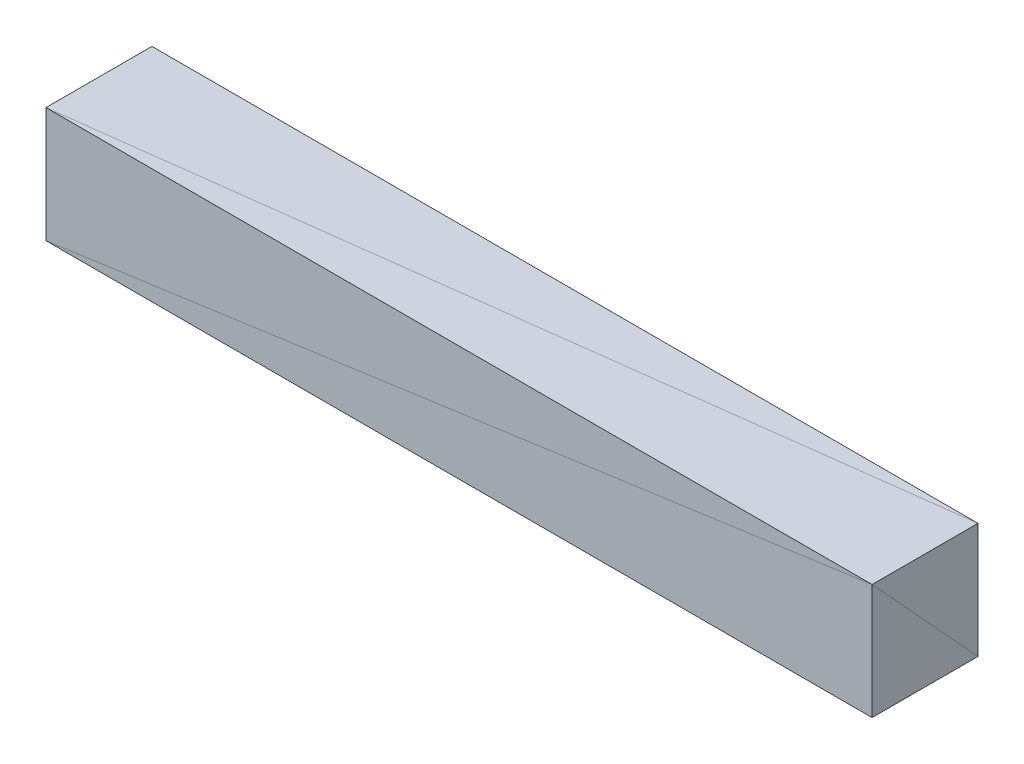
ISO-10303-21;
HEADER;
FILE_DESCRIPTION(('STEP AP214'),'2;1');
FILE_NAME('part.step','',(''),(''),'','','');
FILE_SCHEMA(('AUTOMOTIVE_DESIGN { 1 0 10303 214 1 1 1 1 }'));
ENDSEC;
DATA;
#1=APPLICATION_CONTEXT('core data for automotive mechanical design processes');
#2=APPLICATION_PROTOCOL_DEFINITION('international standard','automotive_design',2000,#1);
#3=PRODUCT_CONTEXT('',#1,'mechanical');
#4=PRODUCT('Part','Part','',(#3));
#5=PRODUCT_RELATED_PRODUCT_CATEGORY('part','',(#4));
#6=PRODUCT_DEFINITION_FORMATION('','',#4);
#7=PRODUCT_DEFINITION_CONTEXT('part definition',#1,'design');
#8=PRODUCT_DEFINITION('design','',#6,#7);
#9=PRODUCT_DEFINITION_SHAPE('','',#8);
#10=(LENGTH_UNIT() NAMED_UNIT(*) SI_UNIT(.MILLI.,.METRE.));
#11=(NAMED_UNIT(*) PLANE_ANGLE_UNIT() SI_UNIT($,.RADIAN.));
#12=(NAMED_UNIT(*) SI_UNIT($,.STERADIAN.) SOLID_ANGLE_UNIT());
#13=UNCERTAINTY_MEASURE_WITH_UNIT(LENGTH_MEASURE(1.E-05),#10,'distance_accuracy_value','');
#14=(GEOMETRIC_REPRESENTATION_CONTEXT(3) GLOBAL_UNCERTAINTY_ASSIGNED_CONTEXT((#13)) GLOBAL_UNIT_ASSIGNED_CONTEXT((#10,
#11,#12)) REPRESENTATION_CONTEXT('',''));
#15=CARTESIAN_POINT('',(0.,0.,0.));
#16=DIRECTION('',(0.,0.,1.));
#17=DIRECTION('',(1.,0.,0.));
#18=AXIS2_PLACEMENT_3D('',#15,#16,#17);
#19=CARTESIAN_POINT('',(-18.8734995524,1.079666694005,4.90299987793));
#20=DIRECTION('',(0.,0.,-1.));
#21=DIRECTION('',(0.,-1.,0.));
#22=AXIS2_PLACEMENT_3D('',#19,#20,#21);
#23=PLANE('',#22);
#24=CARTESIAN_POINT('',(19.353500366211,6.413333257039,4.90299987793));
#25=DIRECTION('',(-1.,0.,0.));
#26=VECTOR('',#25,1.);
#27=LINE('',#24,#26);
#28=CARTESIAN_POINT('',(19.3535003662108,6.41341654459816,4.90299987792983));
#29=VERTEX_POINT('',#28);
#30=CARTESIAN_POINT('',(-18.8734995524001,6.413416544596,4.90299987792915));
#31=VERTEX_POINT('',#30);
#32=EDGE_CURVE('E61',#29,#31,#27,.T.);
#33=ORIENTED_EDGE('',*,*,#32,.T.);
#34=CARTESIAN_POINT('',(-18.8734995524,6.413333257039,4.90299987793));
#35=DIRECTION('',(0.,-1.,0.));
#36=VECTOR('',#35,1.);
#37=LINE('',#34,#36);
#38=CARTESIAN_POINT('',(-18.8734995523997,1.07958336670984,4.90299987792983));
#39=VERTEX_POINT('',#38);
#40=EDGE_CURVE('E65',#31,#39,#37,.T.);
#41=ORIENTED_EDGE('',*,*,#40,.T.);
#42=CARTESIAN_POINT('',(-18.8734995524,1.079666694005,4.90299987793));
#43=DIRECTION('',(0.990406077690972,0.138187558313996,0.));
#44=VECTOR('',#43,1.);
#45=LINE('',#42,#44);
#46=EDGE_CURVE('E58',#39,#29,#45,.T.);
#47=ORIENTED_EDGE('',*,*,#46,.T.);
#48=EDGE_LOOP('',(#33,#41,#47));
#49=FACE_BOUND('',#48,.T.);
#50=ADVANCED_FACE('F16',(#49),#23,.F.);
#51=CARTESIAN_POINT('',(-18.8734995524,1.079666694005,4.90299987793));
#52=DIRECTION('',(0.,0.,-1.));
#53=DIRECTION('',(0.,-1.,0.));
#54=AXIS2_PLACEMENT_3D('',#51,#52,#53);
#55=PLANE('',#54);
#56=CARTESIAN_POINT('',(19.353500366211,1.079666694005,4.90299987793));
#57=DIRECTION('',(0.,1.,0.));
#58=VECTOR('',#57,1.);
#59=LINE('',#56,#58);
#60=CARTESIAN_POINT('',(19.3535003662111,1.079583366712,4.90299987792915));
#61=VERTEX_POINT('',#60);
#62=EDGE_CURVE('E71',#61,#29,#59,.T.);
#63=ORIENTED_EDGE('',*,*,#62,.T.);
#64=ORIENTED_EDGE('',*,*,#46,.F.);
#65=CARTESIAN_POINT('',(-18.8734995524,1.079666694005,4.90299987793));
#66=DIRECTION('',(1.,0.,0.));
#67=VECTOR('',#66,1.);
#68=LINE('',#65,#67);
#69=EDGE_CURVE('E77',#39,#61,#68,.T.);
#70=ORIENTED_EDGE('',*,*,#69,.T.);
#71=EDGE_LOOP('',(#63,#64,#70));
#72=FACE_BOUND('',#71,.T.);
#73=ADVANCED_FACE('F76',(#72),#55,.F.);
#74=CARTESIAN_POINT('',(19.353500366211,1.079500039419,4.90299987793));
#75=DIRECTION('',(-1.,0.,0.));
#76=DIRECTION('',(0.,0.,1.));
#77=AXIS2_PLACEMENT_3D('',#74,#75,#76);
#78=PLANE('',#77);
#79=CARTESIAN_POINT('',(19.353500366211,1.079500039419,0.00100000000869023));
#80=DIRECTION('',(0.,0.736294058048826,0.67666170283384));
#81=VECTOR('',#80,1.);
#82=LINE('',#79,#81);
#83=CARTESIAN_POINT('',(19.353500366211,1.07958336671184,0.00100000000886337));
#84=VERTEX_POINT('',#83);
#85=EDGE_CURVE('E86',#84,#29,#82,.T.);
#86=ORIENTED_EDGE('',*,*,#85,.T.);
#87=ORIENTED_EDGE('',*,*,#62,.F.);
#88=CARTESIAN_POINT('',(19.353500366211,1.079500039419,4.90299987793));
#89=DIRECTION('',(0.,0.,-1.));
#90=VECTOR('',#89,1.);
#91=LINE('',#88,#90);
#92=EDGE_CURVE('E89',#61,#84,#91,.T.);
#93=ORIENTED_EDGE('',*,*,#92,.T.);
#94=EDGE_LOOP('',(#86,#87,#93));
#95=FACE_BOUND('',#94,.T.);
#96=ADVANCED_FACE('F88',(#95),#78,.F.);
#97=CARTESIAN_POINT('',(19.353500366211,6.413499832153,4.90299987793));
#98=DIRECTION('',(0.,-1.,0.));
#99=DIRECTION('',(0.,0.,-1.));
#100=AXIS2_PLACEMENT_3D('',#97,#98,#99);
#101=PLANE('',#100);
#102=CARTESIAN_POINT('',(19.353500366211,6.413499832153,0.00100000000869023));
#103=DIRECTION('',(-0.991878056232386,0.,0.127192458757049));
#104=VECTOR('',#103,1.);
#105=LINE('',#102,#104);
#106=CARTESIAN_POINT('',(19.3535003662109,6.413416544598,0.00100000000954461));
#107=VERTEX_POINT('',#106);
#108=EDGE_CURVE('E105',#107,#31,#105,.T.);
#109=ORIENTED_EDGE('',*,*,#108,.T.);
#110=ORIENTED_EDGE('',*,*,#32,.F.);
#111=CARTESIAN_POINT('',(19.353500366211,6.413499832153,4.90299987793));
#112=DIRECTION('',(0.,0.,-1.));
#113=VECTOR('',#112,1.);
#114=LINE('',#111,#113);
#115=EDGE_CURVE('E97',#29,#107,#114,.T.);
#116=ORIENTED_EDGE('',*,*,#115,.T.);
#117=EDGE_LOOP('',(#109,#110,#116));
#118=FACE_BOUND('',#117,.T.);
#119=ADVANCED_FACE('F102',(#118),#101,.F.);
#120=CARTESIAN_POINT('',(-18.8734995524,6.413499832153,4.90299987793));
#121=DIRECTION('',(1.,0.,0.));
#122=DIRECTION('',(0.,1.,0.));
#123=AXIS2_PLACEMENT_3D('',#120,#121,#122);
#124=PLANE('',#123);
#125=CARTESIAN_POINT('',(-18.8734995524,6.413499832153,0.00100000000869023));
#126=DIRECTION('',(0.,-0.736294058048826,0.67666170283384));
#127=VECTOR('',#126,1.);
#128=LINE('',#125,#127);
#129=CARTESIAN_POINT('',(-18.8734995524,6.41341654459616,0.00100000000886337));
#130=VERTEX_POINT('',#129);
#131=EDGE_CURVE('E214',#130,#39,#128,.T.);
#132=ORIENTED_EDGE('',*,*,#131,.T.);
#133=ORIENTED_EDGE('',*,*,#40,.F.);
#134=CARTESIAN_POINT('',(-18.8734995524,6.413499832153,4.90299987793));
#135=DIRECTION('',(0.,0.,-1.));
#136=VECTOR('',#135,1.);
#137=LINE('',#134,#136);
#138=EDGE_CURVE('E204',#31,#130,#137,.T.);
#139=ORIENTED_EDGE('',*,*,#138,.T.);
#140=EDGE_LOOP('',(#132,#133,#139));
#141=FACE_BOUND('',#140,.T.);
#142=ADVANCED_FACE('F183',(#141),#124,.F.);
#143=CARTESIAN_POINT('',(-18.8734995524,1.079500039419,4.90299987793));
#144=DIRECTION('',(0.,1.,0.));
#145=DIRECTION('',(1.,0.,0.));
#146=AXIS2_PLACEMENT_3D('',#143,#144,#145);
#147=PLANE('',#146);
#148=CARTESIAN_POINT('',(-18.8734995524,1.079500039419,0.00100000000869023));
#149=DIRECTION('',(0.991878056232386,0.,0.127192458757049));
#150=VECTOR('',#149,1.);
#151=LINE('',#148,#150);
#152=CARTESIAN_POINT('',(-18.8734995523998,1.07958336671,0.00100000000954461));
#153=VERTEX_POINT('',#152);
#154=EDGE_CURVE('E116',#153,#61,#151,.T.);
#155=ORIENTED_EDGE('',*,*,#154,.T.);
#156=ORIENTED_EDGE('',*,*,#69,.F.);
#157=CARTESIAN_POINT('',(-18.8734995524,1.079500039419,4.90299987793));
#158=DIRECTION('',(0.,0.,-1.));
#159=VECTOR('',#158,1.);
#160=LINE('',#157,#159);
#161=EDGE_CURVE('E36',#39,#153,#160,.T.);
#162=ORIENTED_EDGE('',*,*,#161,.T.);
#163=EDGE_LOOP('',(#155,#156,#162));
#164=FACE_BOUND('',#163,.T.);
#165=ADVANCED_FACE('F135',(#164),#147,.F.);
#166=CARTESIAN_POINT('',(19.353500366211,1.079500039419,0.001000000008692));
#167=DIRECTION('',(-1.,0.,0.));
#168=DIRECTION('',(0.,0.,1.));
#169=AXIS2_PLACEMENT_3D('',#166,#167,#168);
#170=PLANE('',#169);
#171=ORIENTED_EDGE('',*,*,#115,.F.);
#172=ORIENTED_EDGE('',*,*,#85,.F.);
#173=CARTESIAN_POINT('',(19.353500366211,1.079500039419,0.001000000008692));
#174=DIRECTION('',(0.,1.,0.));
#175=VECTOR('',#174,1.);
#176=LINE('',#173,#175);
#177=EDGE_CURVE('E113',#84,#107,#176,.T.);
#178=ORIENTED_EDGE('',*,*,#177,.T.);
#179=EDGE_LOOP('',(#171,#172,#178));
#180=FACE_BOUND('',#179,.T.);
#181=ADVANCED_FACE('F111',(#180),#170,.F.);
#182=CARTESIAN_POINT('',(-18.8734995524,1.079500039419,0.001000000008692));
#183=DIRECTION('',(0.,1.,0.));
#184=DIRECTION('',(1.,0.,0.));
#185=AXIS2_PLACEMENT_3D('',#182,#183,#184);
#186=PLANE('',#185);
#187=ORIENTED_EDGE('',*,*,#92,.F.);
#188=ORIENTED_EDGE('',*,*,#154,.F.);
#189=CARTESIAN_POINT('',(-18.8734995524,1.079500039419,0.001000000008692));
#190=DIRECTION('',(1.,0.,0.));
#191=VECTOR('',#190,1.);
#192=LINE('',#189,#191);
#193=EDGE_CURVE('E228',#153,#84,#192,.T.);
#194=ORIENTED_EDGE('',*,*,#193,.T.);
#195=EDGE_LOOP('',(#187,#188,#194));
#196=FACE_BOUND('',#195,.T.);
#197=ADVANCED_FACE('F134',(#196),#186,.F.);
#198=CARTESIAN_POINT('',(19.353500366211,6.413499832153,0.001000000008692));
#199=DIRECTION('',(0.,-1.,0.));
#200=DIRECTION('',(0.,0.,-1.));
#201=AXIS2_PLACEMENT_3D('',#198,#199,#200);
#202=PLANE('',#201);
#203=ORIENTED_EDGE('',*,*,#138,.F.);
#204=ORIENTED_EDGE('',*,*,#108,.F.);
#205=CARTESIAN_POINT('',(19.353500366211,6.413499832153,0.001000000008692));
#206=DIRECTION('',(-1.,0.,0.));
#207=VECTOR('',#206,1.);
#208=LINE('',#205,#207);
#209=EDGE_CURVE('E219',#107,#130,#208,.T.);
#210=ORIENTED_EDGE('',*,*,#209,.T.);
#211=EDGE_LOOP('',(#203,#204,#210));
#212=FACE_BOUND('',#211,.T.);
#213=ADVANCED_FACE('F221',(#212),#202,.F.);
#214=CARTESIAN_POINT('',(-18.8734995524,6.413499832153,0.001000000008692));
#215=DIRECTION('',(1.,0.,0.));
#216=DIRECTION('',(0.,1.,0.));
#217=AXIS2_PLACEMENT_3D('',#214,#215,#216);
#218=PLANE('',#217);
#219=ORIENTED_EDGE('',*,*,#161,.F.);
#220=ORIENTED_EDGE('',*,*,#131,.F.);
#221=CARTESIAN_POINT('',(-18.8734995524,6.413499832153,0.001000000008692));
#222=DIRECTION('',(0.,-1.,0.));
#223=VECTOR('',#222,1.);
#224=LINE('',#221,#223);
#225=EDGE_CURVE('E28',#130,#153,#224,.T.);
#226=ORIENTED_EDGE('',*,*,#225,.T.);
#227=EDGE_LOOP('',(#219,#220,#226));
#228=FACE_BOUND('',#227,.T.);
#229=ADVANCED_FACE('F234',(#228),#218,.F.);
#230=CARTESIAN_POINT('',(19.353500366211,1.079666694005,0.001000000008692));
#231=DIRECTION('',(0.,0.,1.));
#232=DIRECTION('',(1.,0.,0.));
#233=AXIS2_PLACEMENT_3D('',#230,#231,#232);
#234=PLANE('',#233);
#235=CARTESIAN_POINT('',(-18.8734995524,1.079666694005,0.001000000008692));
#236=DIRECTION('',(0.990406077690972,0.138187558313996,0.));
#237=VECTOR('',#236,1.);
#238=LINE('',#235,#237);
#239=EDGE_CURVE('E11',#153,#107,#238,.T.);
#240=ORIENTED_EDGE('',*,*,#239,.T.);
#241=ORIENTED_EDGE('',*,*,#177,.F.);
#242=ORIENTED_EDGE('',*,*,#193,.F.);
#243=EDGE_LOOP('',(#240,#241,#242));
#244=FACE_BOUND('',#243,.T.);
#245=ADVANCED_FACE('F261',(#244),#234,.F.);
#246=CARTESIAN_POINT('',(19.353500366211,6.413333257039,0.001000000008692));
#247=DIRECTION('',(0.,0.,1.));
#248=DIRECTION('',(1.,0.,0.));
#249=AXIS2_PLACEMENT_3D('',#246,#247,#248);
#250=PLANE('',#249);
#251=ORIENTED_EDGE('',*,*,#225,.F.);
#252=ORIENTED_EDGE('',*,*,#209,.F.);
#253=ORIENTED_EDGE('',*,*,#239,.F.);
#254=EDGE_LOOP('',(#251,#252,#253));
#255=FACE_BOUND('',#254,.T.);
#256=ADVANCED_FACE('F242',(#255),#250,.F.);
#257=CLOSED_SHELL('',(#50,#73,#96,#119,#142,#165,#181,#197,#213,#229,#245,#256));
#258=MANIFOLD_SOLID_BREP('B1',#257);
#259=ADVANCED_BREP_SHAPE_REPRESENTATION('',(#18,#258),#14);
#260=SHAPE_DEFINITION_REPRESENTATION(#9,#259);
ENDSEC;
END-ISO-10303-21;
